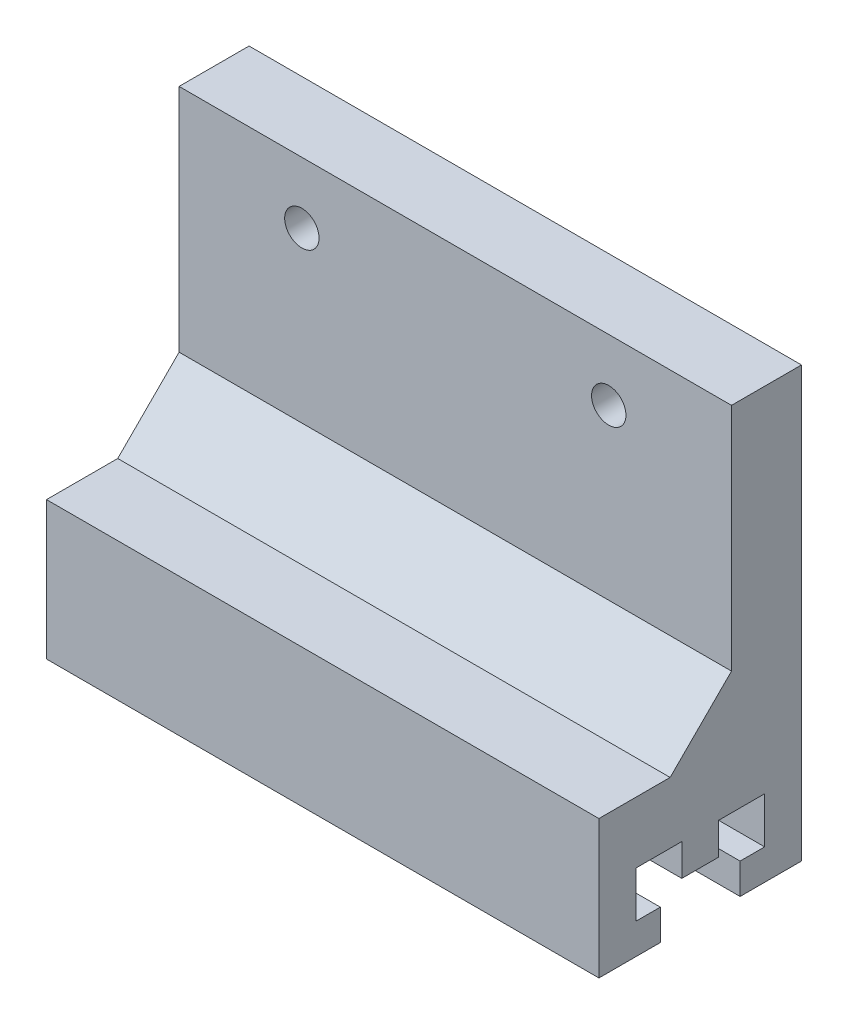
ISO-10303-21;
HEADER;
FILE_DESCRIPTION(('STEP AP214'),'2;1');
FILE_NAME('part.step','',(''),(''),'','','');
FILE_SCHEMA(('AUTOMOTIVE_DESIGN { 1 0 10303 214 1 1 1 1 }'));
ENDSEC;
DATA;
#1=APPLICATION_CONTEXT('core data for automotive mechanical design processes');
#2=APPLICATION_PROTOCOL_DEFINITION('international standard','automotive_design',2000,#1);
#3=PRODUCT_CONTEXT('',#1,'mechanical');
#4=PRODUCT('Part','Part','',(#3));
#5=PRODUCT_RELATED_PRODUCT_CATEGORY('part','',(#4));
#6=PRODUCT_DEFINITION_FORMATION('','',#4);
#7=PRODUCT_DEFINITION_CONTEXT('part definition',#1,'design');
#8=PRODUCT_DEFINITION('design','',#6,#7);
#9=PRODUCT_DEFINITION_SHAPE('','',#8);
#10=(LENGTH_UNIT() NAMED_UNIT(*) SI_UNIT(.MILLI.,.METRE.));
#11=(NAMED_UNIT(*) PLANE_ANGLE_UNIT() SI_UNIT($,.RADIAN.));
#12=(NAMED_UNIT(*) SI_UNIT($,.STERADIAN.) SOLID_ANGLE_UNIT());
#13=UNCERTAINTY_MEASURE_WITH_UNIT(LENGTH_MEASURE(1.E-05),#10,'distance_accuracy_value','');
#14=(GEOMETRIC_REPRESENTATION_CONTEXT(3) GLOBAL_UNCERTAINTY_ASSIGNED_CONTEXT((#13)) GLOBAL_UNIT_ASSIGNED_CONTEXT((#10,
#11,#12)) REPRESENTATION_CONTEXT('',''));
#15=CARTESIAN_POINT('',(0.,0.,0.));
#16=DIRECTION('',(0.,0.,1.));
#17=DIRECTION('',(1.,0.,0.));
#18=AXIS2_PLACEMENT_3D('',#15,#16,#17);
#19=CARTESIAN_POINT('',(90.,7.50000000000002,16.5));
#20=DIRECTION('',(0.,0.,-1.));
#21=DIRECTION('',(0.,1.,0.));
#22=AXIS2_PLACEMENT_3D('',#19,#20,#21);
#23=PLANE('',#22);
#24=DIRECTION('',(0.,-1.,0.));
#25=VECTOR('',#24,1.);
#26=CARTESIAN_POINT('',(0.,7.50000000000002,16.5));
#27=LINE('',#26,#25);
#28=CARTESIAN_POINT('',(0.,7.50000000000002,16.5));
#29=VERTEX_POINT('',#28);
#30=CARTESIAN_POINT('',(0.,-15.,16.5));
#31=VERTEX_POINT('',#30);
#32=EDGE_CURVE('E194',#29,#31,#27,.T.);
#33=ORIENTED_EDGE('',*,*,#32,.T.);
#34=DIRECTION('',(-1.,0.,0.));
#35=VECTOR('',#34,1.);
#36=CARTESIAN_POINT('',(90.,-15.,16.5));
#37=LINE('',#36,#35);
#38=CARTESIAN_POINT('',(90.,-15.,16.5));
#39=VERTEX_POINT('',#38);
#40=EDGE_CURVE('E11',#39,#31,#37,.T.);
#41=ORIENTED_EDGE('',*,*,#40,.F.);
#42=DIRECTION('',(0.,-1.,0.));
#43=VECTOR('',#42,1.);
#44=CARTESIAN_POINT('',(90.,7.50000000000002,16.5));
#45=LINE('',#44,#43);
#46=CARTESIAN_POINT('',(90.,7.50000000000002,16.5));
#47=VERTEX_POINT('',#46);
#48=EDGE_CURVE('E202',#47,#39,#45,.T.);
#49=ORIENTED_EDGE('',*,*,#48,.F.);
#50=DIRECTION('',(-1.,0.,0.));
#51=VECTOR('',#50,1.);
#52=CARTESIAN_POINT('',(90.,7.50000000000002,16.5));
#53=LINE('',#52,#51);
#54=EDGE_CURVE('E240',#47,#29,#53,.T.);
#55=ORIENTED_EDGE('',*,*,#54,.T.);
#56=EDGE_LOOP('',(#33,#41,#49,#55));
#57=FACE_BOUND('',#56,.T.);
#58=ADVANCED_FACE('F37',(#57),#23,.F.);
#59=CARTESIAN_POINT('',(90.,-15.,16.5));
#60=DIRECTION('',(0.,1.,0.));
#61=DIRECTION('',(0.,0.,1.));
#62=AXIS2_PLACEMENT_3D('',#59,#60,#61);
#63=PLANE('',#62);
#64=DIRECTION('',(0.,0.,-1.));
#65=VECTOR('',#64,1.);
#66=CARTESIAN_POINT('',(0.,-15.,16.5));
#67=LINE('',#66,#65);
#68=CARTESIAN_POINT('',(0.,-15.,6.5));
#69=VERTEX_POINT('',#68);
#70=EDGE_CURVE('E197',#31,#69,#67,.T.);
#71=ORIENTED_EDGE('',*,*,#70,.T.);
#72=DIRECTION('',(-1.,0.,0.));
#73=VECTOR('',#72,1.);
#74=CARTESIAN_POINT('',(90.,-15.,6.5));
#75=LINE('',#74,#73);
#76=CARTESIAN_POINT('',(90.,-15.,6.5));
#77=VERTEX_POINT('',#76);
#78=EDGE_CURVE('E45',#77,#69,#75,.T.);
#79=ORIENTED_EDGE('',*,*,#78,.F.);
#80=DIRECTION('',(0.,0.,-1.));
#81=VECTOR('',#80,1.);
#82=CARTESIAN_POINT('',(90.,-15.,16.5));
#83=LINE('',#82,#81);
#84=EDGE_CURVE('E205',#39,#77,#83,.T.);
#85=ORIENTED_EDGE('',*,*,#84,.F.);
#86=ORIENTED_EDGE('',*,*,#40,.T.);
#87=EDGE_LOOP('',(#71,#79,#85,#86));
#88=FACE_BOUND('',#87,.T.);
#89=ADVANCED_FACE('F397',(#88),#63,.F.);
#90=CARTESIAN_POINT('',(90.,-10.,6.5));
#91=DIRECTION('',(0.,0.,-1.));
#92=DIRECTION('',(0.,1.,0.));
#93=AXIS2_PLACEMENT_3D('',#90,#91,#92);
#94=PLANE('',#93);
#95=DIRECTION('',(0.,-1.,0.));
#96=VECTOR('',#95,1.);
#97=CARTESIAN_POINT('',(0.,-10.,6.5));
#98=LINE('',#97,#96);
#99=CARTESIAN_POINT('',(0.,-10.,6.5));
#100=VERTEX_POINT('',#99);
#101=EDGE_CURVE('E244',#100,#69,#98,.T.);
#102=ORIENTED_EDGE('',*,*,#101,.F.);
#103=DIRECTION('',(-1.,0.,0.));
#104=VECTOR('',#103,1.);
#105=CARTESIAN_POINT('',(90.,-10.,6.5));
#106=LINE('',#105,#104);
#107=CARTESIAN_POINT('',(90.,-10.,6.5));
#108=VERTEX_POINT('',#107);
#109=EDGE_CURVE('E306',#108,#100,#106,.T.);
#110=ORIENTED_EDGE('',*,*,#109,.F.);
#111=DIRECTION('',(0.,-1.,0.));
#112=VECTOR('',#111,1.);
#113=CARTESIAN_POINT('',(90.,-10.,6.5));
#114=LINE('',#113,#112);
#115=EDGE_CURVE('E208',#108,#77,#114,.T.);
#116=ORIENTED_EDGE('',*,*,#115,.T.);
#117=ORIENTED_EDGE('',*,*,#78,.T.);
#118=EDGE_LOOP('',(#102,#110,#116,#117));
#119=FACE_BOUND('',#118,.T.);
#120=ADVANCED_FACE('F393',(#119),#94,.T.);
#121=CARTESIAN_POINT('',(90.,-10.,10.5));
#122=DIRECTION('',(0.,1.,0.));
#123=DIRECTION('',(0.,0.,1.));
#124=AXIS2_PLACEMENT_3D('',#121,#122,#123);
#125=PLANE('',#124);
#126=DIRECTION('',(0.,0.,-1.));
#127=VECTOR('',#126,1.);
#128=CARTESIAN_POINT('',(0.,-10.,10.5));
#129=LINE('',#128,#127);
#130=CARTESIAN_POINT('',(0.,-10.,10.5));
#131=VERTEX_POINT('',#130);
#132=EDGE_CURVE('E247',#131,#100,#129,.T.);
#133=ORIENTED_EDGE('',*,*,#132,.F.);
#134=DIRECTION('',(-1.,0.,0.));
#135=VECTOR('',#134,1.);
#136=CARTESIAN_POINT('',(90.,-10.,10.5));
#137=LINE('',#136,#135);
#138=CARTESIAN_POINT('',(90.,-10.,10.5));
#139=VERTEX_POINT('',#138);
#140=EDGE_CURVE('E304',#139,#131,#137,.T.);
#141=ORIENTED_EDGE('',*,*,#140,.F.);
#142=DIRECTION('',(0.,0.,-1.));
#143=VECTOR('',#142,1.);
#144=CARTESIAN_POINT('',(90.,-10.,10.5));
#145=LINE('',#144,#143);
#146=EDGE_CURVE('E211',#139,#108,#145,.T.);
#147=ORIENTED_EDGE('',*,*,#146,.T.);
#148=ORIENTED_EDGE('',*,*,#109,.T.);
#149=EDGE_LOOP('',(#133,#141,#147,#148));
#150=FACE_BOUND('',#149,.T.);
#151=ADVANCED_FACE('F389',(#150),#125,.T.);
#152=CARTESIAN_POINT('',(90.,-2.5,10.5));
#153=DIRECTION('',(0.,0.,-1.));
#154=DIRECTION('',(0.,1.,0.));
#155=AXIS2_PLACEMENT_3D('',#152,#153,#154);
#156=PLANE('',#155);
#157=DIRECTION('',(0.,-1.,0.));
#158=VECTOR('',#157,1.);
#159=CARTESIAN_POINT('',(0.,-2.5,10.5));
#160=LINE('',#159,#158);
#161=CARTESIAN_POINT('',(0.,-2.5,10.5));
#162=VERTEX_POINT('',#161);
#163=EDGE_CURVE('E250',#162,#131,#160,.T.);
#164=ORIENTED_EDGE('',*,*,#163,.F.);
#165=DIRECTION('',(-1.,0.,0.));
#166=VECTOR('',#165,1.);
#167=CARTESIAN_POINT('',(90.,-2.5,10.5));
#168=LINE('',#167,#166);
#169=CARTESIAN_POINT('',(90.,-2.5,10.5));
#170=VERTEX_POINT('',#169);
#171=EDGE_CURVE('E302',#170,#162,#168,.T.);
#172=ORIENTED_EDGE('',*,*,#171,.F.);
#173=DIRECTION('',(0.,-1.,0.));
#174=VECTOR('',#173,1.);
#175=CARTESIAN_POINT('',(90.,-2.5,10.5));
#176=LINE('',#175,#174);
#177=EDGE_CURVE('E214',#170,#139,#176,.T.);
#178=ORIENTED_EDGE('',*,*,#177,.T.);
#179=ORIENTED_EDGE('',*,*,#140,.T.);
#180=EDGE_LOOP('',(#164,#172,#178,#179));
#181=FACE_BOUND('',#180,.T.);
#182=ADVANCED_FACE('F385',(#181),#156,.T.);
#183=CARTESIAN_POINT('',(90.,-2.5,10.5));
#184=DIRECTION('',(0.,1.,0.));
#185=DIRECTION('',(0.,0.,1.));
#186=AXIS2_PLACEMENT_3D('',#183,#184,#185);
#187=PLANE('',#186);
#188=DIRECTION('',(0.,0.,-1.));
#189=VECTOR('',#188,1.);
#190=CARTESIAN_POINT('',(0.,-2.5,10.5));
#191=LINE('',#190,#189);
#192=CARTESIAN_POINT('',(0.,-2.5,3.));
#193=VERTEX_POINT('',#192);
#194=EDGE_CURVE('E253',#162,#193,#191,.T.);
#195=ORIENTED_EDGE('',*,*,#194,.T.);
#196=DIRECTION('',(-1.,0.,0.));
#197=VECTOR('',#196,1.);
#198=CARTESIAN_POINT('',(90.,-2.5,3.));
#199=LINE('',#198,#197);
#200=CARTESIAN_POINT('',(90.,-2.5,3.));
#201=VERTEX_POINT('',#200);
#202=EDGE_CURVE('E299',#201,#193,#199,.T.);
#203=ORIENTED_EDGE('',*,*,#202,.F.);
#204=DIRECTION('',(0.,0.,-1.));
#205=VECTOR('',#204,1.);
#206=CARTESIAN_POINT('',(90.,-2.5,10.5));
#207=LINE('',#206,#205);
#208=EDGE_CURVE('E217',#170,#201,#207,.T.);
#209=ORIENTED_EDGE('',*,*,#208,.F.);
#210=ORIENTED_EDGE('',*,*,#171,.T.);
#211=EDGE_LOOP('',(#195,#203,#209,#210));
#212=FACE_BOUND('',#211,.T.);
#213=ADVANCED_FACE('F381',(#212),#187,.F.);
#214=CARTESIAN_POINT('',(90.,-2.5,3.));
#215=DIRECTION('',(0.,0.,-1.));
#216=DIRECTION('',(0.,1.,0.));
#217=AXIS2_PLACEMENT_3D('',#214,#215,#216);
#218=PLANE('',#217);
#219=DIRECTION('',(0.,-1.,0.));
#220=VECTOR('',#219,1.);
#221=CARTESIAN_POINT('',(0.,-2.5,3.));
#222=LINE('',#221,#220);
#223=CARTESIAN_POINT('',(0.,-7.7,3.));
#224=VERTEX_POINT('',#223);
#225=EDGE_CURVE('E255',#193,#224,#222,.T.);
#226=ORIENTED_EDGE('',*,*,#225,.T.);
#227=DIRECTION('',(-1.,0.,0.));
#228=VECTOR('',#227,1.);
#229=CARTESIAN_POINT('',(90.,-7.7,3.));
#230=LINE('',#229,#228);
#231=CARTESIAN_POINT('',(90.,-7.7,3.));
#232=VERTEX_POINT('',#231);
#233=EDGE_CURVE('E296',#232,#224,#230,.T.);
#234=ORIENTED_EDGE('',*,*,#233,.F.);
#235=DIRECTION('',(0.,-1.,0.));
#236=VECTOR('',#235,1.);
#237=CARTESIAN_POINT('',(90.,-2.5,3.));
#238=LINE('',#237,#236);
#239=EDGE_CURVE('E219',#201,#232,#238,.T.);
#240=ORIENTED_EDGE('',*,*,#239,.F.);
#241=ORIENTED_EDGE('',*,*,#202,.T.);
#242=EDGE_LOOP('',(#226,#234,#240,#241));
#243=FACE_BOUND('',#242,.T.);
#244=ADVANCED_FACE('F377',(#243),#218,.F.);
#245=CARTESIAN_POINT('',(90.,-7.7,3.));
#246=DIRECTION('',(0.,1.,0.));
#247=DIRECTION('',(0.,0.,1.));
#248=AXIS2_PLACEMENT_3D('',#245,#246,#247);
#249=PLANE('',#248);
#250=DIRECTION('',(0.,0.,-1.));
#251=VECTOR('',#250,1.);
#252=CARTESIAN_POINT('',(0.,-7.7,3.));
#253=LINE('',#252,#251);
#254=CARTESIAN_POINT('',(0.,-7.7,-3.));
#255=VERTEX_POINT('',#254);
#256=EDGE_CURVE('E257',#224,#255,#253,.T.);
#257=ORIENTED_EDGE('',*,*,#256,.T.);
#258=DIRECTION('',(-1.,0.,0.));
#259=VECTOR('',#258,1.);
#260=CARTESIAN_POINT('',(90.,-7.7,-3.));
#261=LINE('',#260,#259);
#262=CARTESIAN_POINT('',(90.,-7.7,-3.));
#263=VERTEX_POINT('',#262);
#264=EDGE_CURVE('E294',#263,#255,#261,.T.);
#265=ORIENTED_EDGE('',*,*,#264,.F.);
#266=DIRECTION('',(0.,0.,-1.));
#267=VECTOR('',#266,1.);
#268=CARTESIAN_POINT('',(90.,-7.7,3.));
#269=LINE('',#268,#267);
#270=EDGE_CURVE('E221',#232,#263,#269,.T.);
#271=ORIENTED_EDGE('',*,*,#270,.F.);
#272=ORIENTED_EDGE('',*,*,#233,.T.);
#273=EDGE_LOOP('',(#257,#265,#271,#272));
#274=FACE_BOUND('',#273,.T.);
#275=ADVANCED_FACE('F372',(#274),#249,.F.);
#276=CARTESIAN_POINT('',(90.,-2.5,-3.));
#277=DIRECTION('',(0.,0.,-1.));
#278=DIRECTION('',(0.,1.,0.));
#279=AXIS2_PLACEMENT_3D('',#276,#277,#278);
#280=PLANE('',#279);
#281=DIRECTION('',(0.,-1.,0.));
#282=VECTOR('',#281,1.);
#283=CARTESIAN_POINT('',(0.,-2.5,-3.));
#284=LINE('',#283,#282);
#285=CARTESIAN_POINT('',(0.,-2.5,-3.));
#286=VERTEX_POINT('',#285);
#287=EDGE_CURVE('E260',#286,#255,#284,.T.);
#288=ORIENTED_EDGE('',*,*,#287,.F.);
#289=DIRECTION('',(-1.,0.,0.));
#290=VECTOR('',#289,1.);
#291=CARTESIAN_POINT('',(90.,-2.5,-3.));
#292=LINE('',#291,#290);
#293=CARTESIAN_POINT('',(90.,-2.5,-3.));
#294=VERTEX_POINT('',#293);
#295=EDGE_CURVE('E292',#294,#286,#292,.T.);
#296=ORIENTED_EDGE('',*,*,#295,.F.);
#297=DIRECTION('',(0.,-1.,0.));
#298=VECTOR('',#297,1.);
#299=CARTESIAN_POINT('',(90.,-2.5,-3.));
#300=LINE('',#299,#298);
#301=EDGE_CURVE('E223',#294,#263,#300,.T.);
#302=ORIENTED_EDGE('',*,*,#301,.T.);
#303=ORIENTED_EDGE('',*,*,#264,.T.);
#304=EDGE_LOOP('',(#288,#296,#302,#303));
#305=FACE_BOUND('',#304,.T.);
#306=ADVANCED_FACE('F366',(#305),#280,.T.);
#307=CARTESIAN_POINT('',(90.,-2.5,-3.));
#308=DIRECTION('',(0.,1.,0.));
#309=DIRECTION('',(0.,0.,1.));
#310=AXIS2_PLACEMENT_3D('',#307,#308,#309);
#311=PLANE('',#310);
#312=DIRECTION('',(0.,0.,-1.));
#313=VECTOR('',#312,1.);
#314=CARTESIAN_POINT('',(0.,-2.5,-3.));
#315=LINE('',#314,#313);
#316=CARTESIAN_POINT('',(0.,-2.5,-10.5));
#317=VERTEX_POINT('',#316);
#318=EDGE_CURVE('E263',#286,#317,#315,.T.);
#319=ORIENTED_EDGE('',*,*,#318,.T.);
#320=DIRECTION('',(-1.,0.,0.));
#321=VECTOR('',#320,1.);
#322=CARTESIAN_POINT('',(90.,-2.5,-10.5));
#323=LINE('',#322,#321);
#324=CARTESIAN_POINT('',(90.,-2.5,-10.5));
#325=VERTEX_POINT('',#324);
#326=EDGE_CURVE('E289',#325,#317,#323,.T.);
#327=ORIENTED_EDGE('',*,*,#326,.F.);
#328=DIRECTION('',(0.,0.,-1.));
#329=VECTOR('',#328,1.);
#330=CARTESIAN_POINT('',(90.,-2.5,-3.));
#331=LINE('',#330,#329);
#332=EDGE_CURVE('E226',#294,#325,#331,.T.);
#333=ORIENTED_EDGE('',*,*,#332,.F.);
#334=ORIENTED_EDGE('',*,*,#295,.T.);
#335=EDGE_LOOP('',(#319,#327,#333,#334));
#336=FACE_BOUND('',#335,.T.);
#337=ADVANCED_FACE('F363',(#336),#311,.F.);
#338=CARTESIAN_POINT('',(90.,-2.5,-10.5));
#339=DIRECTION('',(0.,0.,-1.));
#340=DIRECTION('',(0.,1.,0.));
#341=AXIS2_PLACEMENT_3D('',#338,#339,#340);
#342=PLANE('',#341);
#343=DIRECTION('',(0.,-1.,0.));
#344=VECTOR('',#343,1.);
#345=CARTESIAN_POINT('',(0.,-2.5,-10.5));
#346=LINE('',#345,#344);
#347=CARTESIAN_POINT('',(0.,-9.99999999999999,-10.5));
#348=VERTEX_POINT('',#347);
#349=EDGE_CURVE('E265',#317,#348,#346,.T.);
#350=ORIENTED_EDGE('',*,*,#349,.T.);
#351=DIRECTION('',(-1.,0.,0.));
#352=VECTOR('',#351,1.);
#353=CARTESIAN_POINT('',(90.,-9.99999999999999,-10.5));
#354=LINE('',#353,#352);
#355=CARTESIAN_POINT('',(90.,-9.99999999999999,-10.5));
#356=VERTEX_POINT('',#355);
#357=EDGE_CURVE('E287',#356,#348,#354,.T.);
#358=ORIENTED_EDGE('',*,*,#357,.F.);
#359=DIRECTION('',(0.,-1.,0.));
#360=VECTOR('',#359,1.);
#361=CARTESIAN_POINT('',(90.,-2.5,-10.5));
#362=LINE('',#361,#360);
#363=EDGE_CURVE('E228',#325,#356,#362,.T.);
#364=ORIENTED_EDGE('',*,*,#363,.F.);
#365=ORIENTED_EDGE('',*,*,#326,.T.);
#366=EDGE_LOOP('',(#350,#358,#364,#365));
#367=FACE_BOUND('',#366,.T.);
#368=ADVANCED_FACE('F358',(#367),#342,.F.);
#369=CARTESIAN_POINT('',(90.,-9.99999999999999,-6.5));
#370=DIRECTION('',(0.,1.,0.));
#371=DIRECTION('',(0.,0.,1.));
#372=AXIS2_PLACEMENT_3D('',#369,#370,#371);
#373=PLANE('',#372);
#374=DIRECTION('',(0.,0.,-1.));
#375=VECTOR('',#374,1.);
#376=CARTESIAN_POINT('',(0.,-9.99999999999999,-6.5));
#377=LINE('',#376,#375);
#378=CARTESIAN_POINT('',(0.,-9.99999999999999,-6.5));
#379=VERTEX_POINT('',#378);
#380=EDGE_CURVE('E268',#379,#348,#377,.T.);
#381=ORIENTED_EDGE('',*,*,#380,.F.);
#382=DIRECTION('',(-1.,0.,0.));
#383=VECTOR('',#382,1.);
#384=CARTESIAN_POINT('',(90.,-9.99999999999999,-6.5));
#385=LINE('',#384,#383);
#386=CARTESIAN_POINT('',(90.,-9.99999999999999,-6.5));
#387=VERTEX_POINT('',#386);
#388=EDGE_CURVE('E285',#387,#379,#385,.T.);
#389=ORIENTED_EDGE('',*,*,#388,.F.);
#390=DIRECTION('',(0.,0.,-1.));
#391=VECTOR('',#390,1.);
#392=CARTESIAN_POINT('',(90.,-9.99999999999999,-6.5));
#393=LINE('',#392,#391);
#394=EDGE_CURVE('E230',#387,#356,#393,.T.);
#395=ORIENTED_EDGE('',*,*,#394,.T.);
#396=ORIENTED_EDGE('',*,*,#357,.T.);
#397=EDGE_LOOP('',(#381,#389,#395,#396));
#398=FACE_BOUND('',#397,.T.);
#399=ADVANCED_FACE('F352',(#398),#373,.T.);
#400=CARTESIAN_POINT('',(90.,-9.99999999999999,-6.5));
#401=DIRECTION('',(0.,0.,-1.));
#402=DIRECTION('',(-1.,0.,0.));
#403=AXIS2_PLACEMENT_3D('',#400,#401,#402);
#404=PLANE('',#403);
#405=DIRECTION('',(0.,-1.,0.));
#406=VECTOR('',#405,1.);
#407=CARTESIAN_POINT('',(0.,-9.99999999999999,-6.5));
#408=LINE('',#407,#406);
#409=CARTESIAN_POINT('',(0.,-15.,-6.5));
#410=VERTEX_POINT('',#409);
#411=EDGE_CURVE('E271',#379,#410,#408,.T.);
#412=ORIENTED_EDGE('',*,*,#411,.T.);
#413=DIRECTION('',(-1.,0.,0.));
#414=VECTOR('',#413,1.);
#415=CARTESIAN_POINT('',(90.,-15.,-6.5));
#416=LINE('',#415,#414);
#417=CARTESIAN_POINT('',(90.,-15.,-6.5));
#418=VERTEX_POINT('',#417);
#419=EDGE_CURVE('E282',#418,#410,#416,.T.);
#420=ORIENTED_EDGE('',*,*,#419,.F.);
#421=DIRECTION('',(0.,-1.,0.));
#422=VECTOR('',#421,1.);
#423=CARTESIAN_POINT('',(90.,-9.99999999999999,-6.5));
#424=LINE('',#423,#422);
#425=EDGE_CURVE('E233',#387,#418,#424,.T.);
#426=ORIENTED_EDGE('',*,*,#425,.F.);
#427=ORIENTED_EDGE('',*,*,#388,.T.);
#428=EDGE_LOOP('',(#412,#420,#426,#427));
#429=FACE_BOUND('',#428,.T.);
#430=ADVANCED_FACE('F349',(#429),#404,.F.);
#431=CARTESIAN_POINT('',(90.,-15.,-6.5));
#432=DIRECTION('',(0.,1.,0.));
#433=DIRECTION('',(0.,0.,1.));
#434=AXIS2_PLACEMENT_3D('',#431,#432,#433);
#435=PLANE('',#434);
#436=DIRECTION('',(0.,0.,-1.));
#437=VECTOR('',#436,1.);
#438=CARTESIAN_POINT('',(0.,-15.,-6.5));
#439=LINE('',#438,#437);
#440=CARTESIAN_POINT('',(0.,-15.,-16.5));
#441=VERTEX_POINT('',#440);
#442=EDGE_CURVE('E273',#410,#441,#439,.T.);
#443=ORIENTED_EDGE('',*,*,#442,.T.);
#444=DIRECTION('',(-1.,0.,0.));
#445=VECTOR('',#444,1.);
#446=CARTESIAN_POINT('',(90.,-15.,-16.5));
#447=LINE('',#446,#445);
#448=CARTESIAN_POINT('',(90.,-15.,-16.5));
#449=VERTEX_POINT('',#448);
#450=EDGE_CURVE('E280',#449,#441,#447,.T.);
#451=ORIENTED_EDGE('',*,*,#450,.F.);
#452=DIRECTION('',(0.,0.,-1.));
#453=VECTOR('',#452,1.);
#454=CARTESIAN_POINT('',(90.,-15.,-6.5));
#455=LINE('',#454,#453);
#456=EDGE_CURVE('E235',#418,#449,#455,.T.);
#457=ORIENTED_EDGE('',*,*,#456,.F.);
#458=ORIENTED_EDGE('',*,*,#419,.T.);
#459=EDGE_LOOP('',(#443,#451,#457,#458));
#460=FACE_BOUND('',#459,.T.);
#461=ADVANCED_FACE('F344',(#460),#435,.F.);
#462=CARTESIAN_POINT('',(90.,7.50000000000002,-16.5));
#463=DIRECTION('',(0.,0.,-1.));
#464=DIRECTION('',(-1.,0.,0.));
#465=AXIS2_PLACEMENT_3D('',#462,#463,#464);
#466=PLANE('',#465);
#467=CARTESIAN_POINT('',(70.,45.,-16.5));
#468=DIRECTION('',(0.,0.,-1.));
#469=DIRECTION('',(-1.,0.,0.));
#470=AXIS2_PLACEMENT_3D('',#467,#468,#469);
#471=CIRCLE('',#470,5.5);
#472=CARTESIAN_POINT('',(64.5,45.,-16.5));
#473=VERTEX_POINT('',#472);
#474=EDGE_CURVE('E328',#473,#473,#471,.T.);
#475=ORIENTED_EDGE('',*,*,#474,.F.);
#476=EDGE_LOOP('',(#475));
#477=FACE_BOUND('',#476,.T.);
#478=CARTESIAN_POINT('',(20.,45.,-16.5));
#479=DIRECTION('',(0.,0.,-1.));
#480=DIRECTION('',(-1.,0.,0.));
#481=AXIS2_PLACEMENT_3D('',#478,#479,#480);
#482=CIRCLE('',#481,5.5);
#483=CARTESIAN_POINT('',(14.5,45.,-16.5));
#484=VERTEX_POINT('',#483);
#485=EDGE_CURVE('E331',#484,#484,#482,.T.);
#486=ORIENTED_EDGE('',*,*,#485,.F.);
#487=EDGE_LOOP('',(#486));
#488=FACE_BOUND('',#487,.T.);
#489=DIRECTION('',(0.,-1.,0.));
#490=VECTOR('',#489,1.);
#491=CARTESIAN_POINT('',(0.,7.50000000000002,-16.5));
#492=LINE('',#491,#490);
#493=CARTESIAN_POINT('',(0.,55.,-16.5));
#494=VERTEX_POINT('',#493);
#495=EDGE_CURVE('E276',#494,#441,#492,.T.);
#496=ORIENTED_EDGE('',*,*,#495,.F.);
#497=DIRECTION('',(-1.,0.,0.));
#498=VECTOR('',#497,1.);
#499=CARTESIAN_POINT('',(0.,55.,-16.5));
#500=LINE('',#499,#498);
#501=CARTESIAN_POINT('',(90.,55.,-16.5));
#502=VERTEX_POINT('',#501);
#503=EDGE_CURVE('E185',#502,#494,#500,.T.);
#504=ORIENTED_EDGE('',*,*,#503,.F.);
#505=DIRECTION('',(0.,-1.,0.));
#506=VECTOR('',#505,1.);
#507=CARTESIAN_POINT('',(90.,7.50000000000002,-16.5));
#508=LINE('',#507,#506);
#509=EDGE_CURVE('E237',#502,#449,#508,.T.);
#510=ORIENTED_EDGE('',*,*,#509,.T.);
#511=ORIENTED_EDGE('',*,*,#450,.T.);
#512=EDGE_LOOP('',(#496,#504,#510,#511));
#513=FACE_BOUND('',#512,.T.);
#514=ADVANCED_FACE('F338',(#477,#488,#513),#466,.T.);
#515=CARTESIAN_POINT('',(90.,7.50000000000002,16.5));
#516=DIRECTION('',(0.,1.,0.));
#517=DIRECTION('',(0.,0.,1.));
#518=AXIS2_PLACEMENT_3D('',#515,#516,#517);
#519=PLANE('',#518);
#520=DIRECTION('',(-1.,0.,0.));
#521=VECTOR('',#520,1.);
#522=CARTESIAN_POINT('',(90.,7.50000000000002,4.9));
#523=LINE('',#522,#521);
#524=CARTESIAN_POINT('',(90.,7.50000000000002,4.9));
#525=VERTEX_POINT('',#524);
#526=CARTESIAN_POINT('',(0.,7.50000000000002,4.9));
#527=VERTEX_POINT('',#526);
#528=EDGE_CURVE('E57',#525,#527,#523,.T.);
#529=ORIENTED_EDGE('',*,*,#528,.T.);
#530=DIRECTION('',(0.,0.,-1.));
#531=VECTOR('',#530,1.);
#532=CARTESIAN_POINT('',(0.,7.50000000000002,16.5));
#533=LINE('',#532,#531);
#534=EDGE_CURVE('E206',#29,#527,#533,.T.);
#535=ORIENTED_EDGE('',*,*,#534,.F.);
#536=ORIENTED_EDGE('',*,*,#54,.F.);
#537=DIRECTION('',(0.,0.,-1.));
#538=VECTOR('',#537,1.);
#539=CARTESIAN_POINT('',(90.,7.50000000000002,16.5));
#540=LINE('',#539,#538);
#541=EDGE_CURVE('E53',#47,#525,#540,.T.);
#542=ORIENTED_EDGE('',*,*,#541,.T.);
#543=EDGE_LOOP('',(#529,#535,#536,#542));
#544=FACE_BOUND('',#543,.T.);
#545=ADVANCED_FACE('F401',(#544),#519,.T.);
#546=CARTESIAN_POINT('',(90.,0.,0.));
#547=DIRECTION('',(1.,0.,0.));
#548=DIRECTION('',(0.,0.,-1.));
#549=AXIS2_PLACEMENT_3D('',#546,#547,#548);
#550=PLANE('',#549);
#551=DIRECTION('',(0.,0.707106781186548,-0.707106781186547));
#552=VECTOR('',#551,1.);
#553=CARTESIAN_POINT('',(90.,17.5,-5.09999999999999));
#554=LINE('',#553,#552);
#555=CARTESIAN_POINT('',(90.,17.5,-5.1));
#556=VERTEX_POINT('',#555);
#557=EDGE_CURVE('E405',#525,#556,#554,.T.);
#558=ORIENTED_EDGE('',*,*,#557,.F.);
#559=ORIENTED_EDGE('',*,*,#541,.F.);
#560=ORIENTED_EDGE('',*,*,#48,.T.);
#561=ORIENTED_EDGE('',*,*,#84,.T.);
#562=ORIENTED_EDGE('',*,*,#115,.F.);
#563=ORIENTED_EDGE('',*,*,#146,.F.);
#564=ORIENTED_EDGE('',*,*,#177,.F.);
#565=ORIENTED_EDGE('',*,*,#208,.T.);
#566=ORIENTED_EDGE('',*,*,#239,.T.);
#567=ORIENTED_EDGE('',*,*,#270,.T.);
#568=ORIENTED_EDGE('',*,*,#301,.F.);
#569=ORIENTED_EDGE('',*,*,#332,.T.);
#570=ORIENTED_EDGE('',*,*,#363,.T.);
#571=ORIENTED_EDGE('',*,*,#394,.F.);
#572=ORIENTED_EDGE('',*,*,#425,.T.);
#573=ORIENTED_EDGE('',*,*,#456,.T.);
#574=ORIENTED_EDGE('',*,*,#509,.F.);
#575=DIRECTION('',(0.,0.,-1.));
#576=VECTOR('',#575,1.);
#577=CARTESIAN_POINT('',(90.,55.,-16.5));
#578=LINE('',#577,#576);
#579=CARTESIAN_POINT('',(90.,55.,-5.09999999999999));
#580=VERTEX_POINT('',#579);
#581=EDGE_CURVE('E178',#580,#502,#578,.T.);
#582=ORIENTED_EDGE('',*,*,#581,.F.);
#583=DIRECTION('',(0.,-1.,0.));
#584=VECTOR('',#583,1.);
#585=CARTESIAN_POINT('',(90.,55.,-5.09999999999999));
#586=LINE('',#585,#584);
#587=EDGE_CURVE('E174',#580,#556,#586,.T.);
#588=ORIENTED_EDGE('',*,*,#587,.T.);
#589=EDGE_LOOP('',(#558,#559,#560,#561,#562,#563,#564,#565,#566,#567,#568,#569,#570,#571,#572,
#573,#574,#582,#588));
#590=FACE_BOUND('',#589,.T.);
#591=ADVANCED_FACE('F403',(#590),#550,.T.);
#592=CARTESIAN_POINT('',(0.,0.,0.));
#593=DIRECTION('',(1.,0.,0.));
#594=DIRECTION('',(0.,0.,-1.));
#595=AXIS2_PLACEMENT_3D('',#592,#593,#594);
#596=PLANE('',#595);
#597=ORIENTED_EDGE('',*,*,#534,.T.);
#598=DIRECTION('',(0.,0.707106781186548,-0.707106781186547));
#599=VECTOR('',#598,1.);
#600=CARTESIAN_POINT('',(0.,17.5,-5.09999999999999));
#601=LINE('',#600,#599);
#602=CARTESIAN_POINT('',(0.,17.5,-5.09999999999999));
#603=VERTEX_POINT('',#602);
#604=EDGE_CURVE('E193',#527,#603,#601,.T.);
#605=ORIENTED_EDGE('',*,*,#604,.T.);
#606=DIRECTION('',(0.,-1.,0.));
#607=VECTOR('',#606,1.);
#608=CARTESIAN_POINT('',(0.,55.,-5.09999999999999));
#609=LINE('',#608,#607);
#610=CARTESIAN_POINT('',(0.,55.,-5.09999999999999));
#611=VERTEX_POINT('',#610);
#612=EDGE_CURVE('E171',#611,#603,#609,.T.);
#613=ORIENTED_EDGE('',*,*,#612,.F.);
#614=DIRECTION('',(0.,0.,1.));
#615=VECTOR('',#614,1.);
#616=CARTESIAN_POINT('',(0.,55.,-5.09999999999999));
#617=LINE('',#616,#615);
#618=EDGE_CURVE('E179',#494,#611,#617,.T.);
#619=ORIENTED_EDGE('',*,*,#618,.F.);
#620=ORIENTED_EDGE('',*,*,#495,.T.);
#621=ORIENTED_EDGE('',*,*,#442,.F.);
#622=ORIENTED_EDGE('',*,*,#411,.F.);
#623=ORIENTED_EDGE('',*,*,#380,.T.);
#624=ORIENTED_EDGE('',*,*,#349,.F.);
#625=ORIENTED_EDGE('',*,*,#318,.F.);
#626=ORIENTED_EDGE('',*,*,#287,.T.);
#627=ORIENTED_EDGE('',*,*,#256,.F.);
#628=ORIENTED_EDGE('',*,*,#225,.F.);
#629=ORIENTED_EDGE('',*,*,#194,.F.);
#630=ORIENTED_EDGE('',*,*,#163,.T.);
#631=ORIENTED_EDGE('',*,*,#132,.T.);
#632=ORIENTED_EDGE('',*,*,#101,.T.);
#633=ORIENTED_EDGE('',*,*,#70,.F.);
#634=ORIENTED_EDGE('',*,*,#32,.F.);
#635=EDGE_LOOP('',(#597,#605,#613,#619,#620,#621,#622,#623,#624,#625,#626,#627,#628,#629,#630,
#631,#632,#633,#634));
#636=FACE_BOUND('',#635,.T.);
#637=ADVANCED_FACE('F191',(#636),#596,.F.);
#638=CARTESIAN_POINT('',(90.,55.,-5.09999999999999));
#639=DIRECTION('',(0.,0.,-1.));
#640=DIRECTION('',(0.,1.,0.));
#641=AXIS2_PLACEMENT_3D('',#638,#639,#640);
#642=PLANE('',#641);
#643=CARTESIAN_POINT('',(70.,45.,-5.09999999999999));
#644=DIRECTION('',(0.,0.,-1.));
#645=DIRECTION('',(0.,1.,0.));
#646=AXIS2_PLACEMENT_3D('',#643,#644,#645);
#647=CIRCLE('',#646,2.79999999999999);
#648=CARTESIAN_POINT('',(70.,47.8,-5.09999999999999));
#649=VERTEX_POINT('',#648);
#650=EDGE_CURVE('E40',#649,#649,#647,.T.);
#651=ORIENTED_EDGE('',*,*,#650,.T.);
#652=EDGE_LOOP('',(#651));
#653=FACE_BOUND('',#652,.T.);
#654=CARTESIAN_POINT('',(20.,45.,-5.09999999999999));
#655=DIRECTION('',(0.,0.,-1.));
#656=DIRECTION('',(0.,1.,0.));
#657=AXIS2_PLACEMENT_3D('',#654,#655,#656);
#658=CIRCLE('',#657,2.8);
#659=CARTESIAN_POINT('',(20.,47.8,-5.09999999999999));
#660=VERTEX_POINT('',#659);
#661=EDGE_CURVE('E308',#660,#660,#658,.T.);
#662=ORIENTED_EDGE('',*,*,#661,.T.);
#663=EDGE_LOOP('',(#662));
#664=FACE_BOUND('',#663,.T.);
#665=ORIENTED_EDGE('',*,*,#612,.T.);
#666=DIRECTION('',(-1.,0.,0.));
#667=VECTOR('',#666,1.);
#668=CARTESIAN_POINT('',(90.,17.5,-5.09999999999999));
#669=LINE('',#668,#667);
#670=EDGE_CURVE('E321',#556,#603,#669,.T.);
#671=ORIENTED_EDGE('',*,*,#670,.F.);
#672=ORIENTED_EDGE('',*,*,#587,.F.);
#673=DIRECTION('',(1.,0.,0.));
#674=VECTOR('',#673,1.);
#675=CARTESIAN_POINT('',(90.,55.,-5.09999999999999));
#676=LINE('',#675,#674);
#677=EDGE_CURVE('E167',#611,#580,#676,.T.);
#678=ORIENTED_EDGE('',*,*,#677,.F.);
#679=EDGE_LOOP('',(#665,#671,#672,#678));
#680=FACE_BOUND('',#679,.T.);
#681=ADVANCED_FACE('F169',(#653,#664,#680),#642,.F.);
#682=CARTESIAN_POINT('',(0.,55.,0.));
#683=DIRECTION('',(0.,-1.,0.));
#684=DIRECTION('',(0.,0.,-1.));
#685=AXIS2_PLACEMENT_3D('',#682,#683,#684);
#686=PLANE('',#685);
#687=ORIENTED_EDGE('',*,*,#618,.T.);
#688=ORIENTED_EDGE('',*,*,#677,.T.);
#689=ORIENTED_EDGE('',*,*,#581,.T.);
#690=ORIENTED_EDGE('',*,*,#503,.T.);
#691=EDGE_LOOP('',(#687,#688,#689,#690));
#692=FACE_BOUND('',#691,.T.);
#693=ADVANCED_FACE('F183',(#692),#686,.F.);
#694=CARTESIAN_POINT('',(20.,45.,-11.));
#695=DIRECTION('',(0.,0.,-1.));
#696=DIRECTION('',(-1.,0.,0.));
#697=AXIS2_PLACEMENT_3D('',#694,#695,#696);
#698=CYLINDRICAL_SURFACE('',#697,5.5);
#699=CARTESIAN_POINT('',(20.,45.,-11.));
#700=DIRECTION('',(0.,0.,-1.));
#701=DIRECTION('',(-1.,0.,0.));
#702=AXIS2_PLACEMENT_3D('',#699,#700,#701);
#703=CIRCLE('',#702,5.5);
#704=CARTESIAN_POINT('',(14.5,45.,-11.));
#705=VERTEX_POINT('',#704);
#706=EDGE_CURVE('E314',#705,#705,#703,.T.);
#707=ORIENTED_EDGE('',*,*,#706,.F.);
#708=EDGE_LOOP('',(#707));
#709=FACE_BOUND('',#708,.T.);
#710=ORIENTED_EDGE('',*,*,#485,.T.);
#711=EDGE_LOOP('',(#710));
#712=FACE_BOUND('',#711,.T.);
#713=ADVANCED_FACE('F463',(#709,#712),#698,.F.);
#714=CARTESIAN_POINT('',(20.,45.,-11.));
#715=DIRECTION('',(0.,0.,-1.));
#716=DIRECTION('',(-1.,0.,0.));
#717=AXIS2_PLACEMENT_3D('',#714,#715,#716);
#718=PLANE('',#717);
#719=CARTESIAN_POINT('',(20.,45.,-11.));
#720=DIRECTION('',(0.,0.,-1.));
#721=DIRECTION('',(-1.,0.,0.));
#722=AXIS2_PLACEMENT_3D('',#719,#720,#721);
#723=CIRCLE('',#722,2.8);
#724=CARTESIAN_POINT('',(17.2,45.,-11.));
#725=VERTEX_POINT('',#724);
#726=EDGE_CURVE('E316',#725,#725,#723,.T.);
#727=ORIENTED_EDGE('',*,*,#726,.F.);
#728=EDGE_LOOP('',(#727));
#729=FACE_BOUND('',#728,.T.);
#730=ORIENTED_EDGE('',*,*,#706,.T.);
#731=EDGE_LOOP('',(#730));
#732=FACE_BOUND('',#731,.T.);
#733=ADVANCED_FACE('F464',(#729,#732),#718,.T.);
#734=CARTESIAN_POINT('',(70.,45.,-11.));
#735=DIRECTION('',(0.,0.,-1.));
#736=DIRECTION('',(-1.,0.,0.));
#737=AXIS2_PLACEMENT_3D('',#734,#735,#736);
#738=CYLINDRICAL_SURFACE('',#737,5.5);
#739=CARTESIAN_POINT('',(70.,45.,-11.));
#740=DIRECTION('',(0.,0.,-1.));
#741=DIRECTION('',(-1.,0.,0.));
#742=AXIS2_PLACEMENT_3D('',#739,#740,#741);
#743=CIRCLE('',#742,5.5);
#744=CARTESIAN_POINT('',(64.5,45.,-11.));
#745=VERTEX_POINT('',#744);
#746=EDGE_CURVE('E188',#745,#745,#743,.T.);
#747=ORIENTED_EDGE('',*,*,#746,.F.);
#748=EDGE_LOOP('',(#747));
#749=FACE_BOUND('',#748,.T.);
#750=ORIENTED_EDGE('',*,*,#474,.T.);
#751=EDGE_LOOP('',(#750));
#752=FACE_BOUND('',#751,.T.);
#753=ADVANCED_FACE('F467',(#749,#752),#738,.F.);
#754=CARTESIAN_POINT('',(70.,45.,-11.));
#755=DIRECTION('',(0.,0.,-1.));
#756=DIRECTION('',(-1.,0.,0.));
#757=AXIS2_PLACEMENT_3D('',#754,#755,#756);
#758=PLANE('',#757);
#759=CARTESIAN_POINT('',(70.,45.,-11.));
#760=DIRECTION('',(0.,0.,-1.));
#761=DIRECTION('',(-1.,0.,0.));
#762=AXIS2_PLACEMENT_3D('',#759,#760,#761);
#763=CIRCLE('',#762,2.79999999999999);
#764=CARTESIAN_POINT('',(67.2,45.,-11.));
#765=VERTEX_POINT('',#764);
#766=EDGE_CURVE('E310',#765,#765,#763,.T.);
#767=ORIENTED_EDGE('',*,*,#766,.F.);
#768=EDGE_LOOP('',(#767));
#769=FACE_BOUND('',#768,.T.);
#770=ORIENTED_EDGE('',*,*,#746,.T.);
#771=EDGE_LOOP('',(#770));
#772=FACE_BOUND('',#771,.T.);
#773=ADVANCED_FACE('F474',(#769,#772),#758,.T.);
#774=CARTESIAN_POINT('',(20.,45.,-1.));
#775=DIRECTION('',(0.,0.,-1.));
#776=DIRECTION('',(-1.,0.,0.));
#777=AXIS2_PLACEMENT_3D('',#774,#775,#776);
#778=CYLINDRICAL_SURFACE('',#777,2.8);
#779=ORIENTED_EDGE('',*,*,#726,.T.);
#780=EDGE_LOOP('',(#779));
#781=FACE_BOUND('',#780,.T.);
#782=ORIENTED_EDGE('',*,*,#661,.F.);
#783=EDGE_LOOP('',(#782));
#784=FACE_BOUND('',#783,.T.);
#785=ADVANCED_FACE('F416',(#781,#784),#778,.F.);
#786=CARTESIAN_POINT('',(70.,45.,-1.));
#787=DIRECTION('',(0.,0.,-1.));
#788=DIRECTION('',(-1.,0.,0.));
#789=AXIS2_PLACEMENT_3D('',#786,#787,#788);
#790=CYLINDRICAL_SURFACE('',#789,2.79999999999999);
#791=ORIENTED_EDGE('',*,*,#766,.T.);
#792=EDGE_LOOP('',(#791));
#793=FACE_BOUND('',#792,.T.);
#794=ORIENTED_EDGE('',*,*,#650,.F.);
#795=EDGE_LOOP('',(#794));
#796=FACE_BOUND('',#795,.T.);
#797=ADVANCED_FACE('F411',(#793,#796),#790,.F.);
#798=CARTESIAN_POINT('',(90.,17.5,-5.09999999999999));
#799=DIRECTION('',(0.,0.707106781186547,0.707106781186548));
#800=DIRECTION('',(0.,-0.707106781186548,0.707106781186547));
#801=AXIS2_PLACEMENT_3D('',#798,#799,#800);
#802=PLANE('',#801);
#803=ORIENTED_EDGE('',*,*,#604,.F.);
#804=ORIENTED_EDGE('',*,*,#528,.F.);
#805=ORIENTED_EDGE('',*,*,#557,.T.);
#806=ORIENTED_EDGE('',*,*,#670,.T.);
#807=EDGE_LOOP('',(#803,#804,#805,#806));
#808=FACE_BOUND('',#807,.T.);
#809=ADVANCED_FACE('F409',(#808),#802,.T.);
#810=CLOSED_SHELL('',(#58,#89,#120,#151,#182,#213,#244,#275,#306,#337,#368,#399,#430,#461,#514,
#545,#591,#637,#681,#693,#713,#733,#753,#773,#785,#797,#809));
#811=MANIFOLD_SOLID_BREP('B2',#810);
#812=ADVANCED_BREP_SHAPE_REPRESENTATION('',(#18,#811),#14);
#813=SHAPE_DEFINITION_REPRESENTATION(#9,#812);
ENDSEC;
END-ISO-10303-21;
